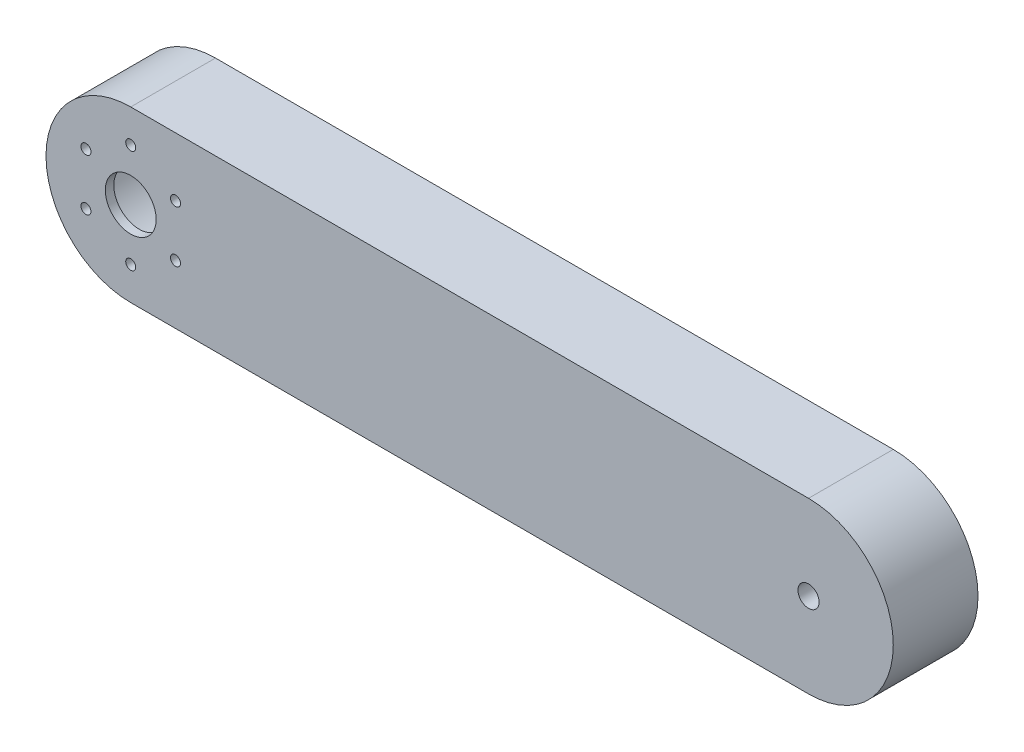
ISO-10303-21;
HEADER;
FILE_DESCRIPTION(('STEP AP214'),'2;1');
FILE_NAME('part.step','',(''),(''),'','','');
FILE_SCHEMA(('AUTOMOTIVE_DESIGN { 1 0 10303 214 1 1 1 1 }'));
ENDSEC;
DATA;
#1=APPLICATION_CONTEXT('core data for automotive mechanical design processes');
#2=APPLICATION_PROTOCOL_DEFINITION('international standard','automotive_design',2000,#1);
#3=PRODUCT_CONTEXT('',#1,'mechanical');
#4=PRODUCT('Part','Part','',(#3));
#5=PRODUCT_RELATED_PRODUCT_CATEGORY('part','',(#4));
#6=PRODUCT_DEFINITION_FORMATION('','',#4);
#7=PRODUCT_DEFINITION_CONTEXT('part definition',#1,'design');
#8=PRODUCT_DEFINITION('design','',#6,#7);
#9=PRODUCT_DEFINITION_SHAPE('','',#8);
#10=(LENGTH_UNIT() NAMED_UNIT(*) SI_UNIT(.MILLI.,.METRE.));
#11=(NAMED_UNIT(*) PLANE_ANGLE_UNIT() SI_UNIT($,.RADIAN.));
#12=(NAMED_UNIT(*) SI_UNIT($,.STERADIAN.) SOLID_ANGLE_UNIT());
#13=UNCERTAINTY_MEASURE_WITH_UNIT(LENGTH_MEASURE(1.E-05),#10,'distance_accuracy_value','');
#14=(GEOMETRIC_REPRESENTATION_CONTEXT(3) GLOBAL_UNCERTAINTY_ASSIGNED_CONTEXT((#13)) GLOBAL_UNIT_ASSIGNED_CONTEXT((#10,
#11,#12)) REPRESENTATION_CONTEXT('',''));
#15=CARTESIAN_POINT('',(0.,0.,0.));
#16=DIRECTION('',(0.,0.,1.));
#17=DIRECTION('',(1.,0.,0.));
#18=AXIS2_PLACEMENT_3D('',#15,#16,#17);
#19=CARTESIAN_POINT('',(-101.6,0.,22.86));
#20=DIRECTION('',(0.,0.,1.));
#21=DIRECTION('',(1.,0.,0.));
#22=AXIS2_PLACEMENT_3D('',#19,#20,#21);
#23=PLANE('',#22);
#24=CARTESIAN_POINT('',(-88.1766062517335,7.74999999399999,22.86));
#25=DIRECTION('',(0.,0.,-1.));
#26=DIRECTION('',(-1.,0.,0.));
#27=AXIS2_PLACEMENT_3D('',#24,#25,#26);
#28=CIRCLE('',#27,1.50000004800001);
#29=CARTESIAN_POINT('',(-89.6766062997335,7.74999999399999,22.86));
#30=VERTEX_POINT('',#29);
#31=EDGE_CURVE('E166',#30,#30,#28,.T.);
#32=ORIENTED_EDGE('',*,*,#31,.F.);
#33=EDGE_LOOP('',(#32));
#34=FACE_BOUND('',#33,.T.);
#35=CARTESIAN_POINT('',(-88.1766062517335,-7.74999999400002,22.86));
#36=DIRECTION('',(0.,0.,-1.));
#37=DIRECTION('',(-1.,0.,0.));
#38=AXIS2_PLACEMENT_3D('',#35,#36,#37);
#39=CIRCLE('',#38,1.50000004800001);
#40=CARTESIAN_POINT('',(-89.6766062997335,-7.74999999400002,22.86));
#41=VERTEX_POINT('',#40);
#42=EDGE_CURVE('E173',#41,#41,#39,.T.);
#43=ORIENTED_EDGE('',*,*,#42,.F.);
#44=EDGE_LOOP('',(#43));
#45=FACE_BOUND('',#44,.T.);
#46=CARTESIAN_POINT('',(-101.6,-15.499999988,22.86));
#47=DIRECTION('',(0.,0.,-1.));
#48=DIRECTION('',(-1.,0.,0.));
#49=AXIS2_PLACEMENT_3D('',#46,#47,#48);
#50=CIRCLE('',#49,1.500000048);
#51=CARTESIAN_POINT('',(-103.100000048,-15.499999988,22.86));
#52=VERTEX_POINT('',#51);
#53=EDGE_CURVE('E179',#52,#52,#50,.T.);
#54=ORIENTED_EDGE('',*,*,#53,.F.);
#55=EDGE_LOOP('',(#54));
#56=FACE_BOUND('',#55,.T.);
#57=CARTESIAN_POINT('',(-115.023393748266,-7.74999999400001,22.86));
#58=DIRECTION('',(0.,0.,-1.));
#59=DIRECTION('',(-1.,0.,0.));
#60=AXIS2_PLACEMENT_3D('',#57,#58,#59);
#61=CIRCLE('',#60,1.50000004800001);
#62=CARTESIAN_POINT('',(-116.523393796267,-7.74999999400001,22.86));
#63=VERTEX_POINT('',#62);
#64=EDGE_CURVE('E185',#63,#63,#61,.T.);
#65=ORIENTED_EDGE('',*,*,#64,.F.);
#66=EDGE_LOOP('',(#65));
#67=FACE_BOUND('',#66,.T.);
#68=CARTESIAN_POINT('',(-115.023393748266,7.74999999399999,22.86));
#69=DIRECTION('',(0.,0.,-1.));
#70=DIRECTION('',(-1.,0.,0.));
#71=AXIS2_PLACEMENT_3D('',#68,#69,#70);
#72=CIRCLE('',#71,1.500000048);
#73=CARTESIAN_POINT('',(-116.523393796267,7.74999999399999,22.86));
#74=VERTEX_POINT('',#73);
#75=EDGE_CURVE('E191',#74,#74,#72,.T.);
#76=ORIENTED_EDGE('',*,*,#75,.F.);
#77=EDGE_LOOP('',(#76));
#78=FACE_BOUND('',#77,.T.);
#79=CARTESIAN_POINT('',(-101.6,15.499999988,22.86));
#80=DIRECTION('',(0.,0.,-1.));
#81=DIRECTION('',(-1.,0.,0.));
#82=AXIS2_PLACEMENT_3D('',#79,#80,#81);
#83=CIRCLE('',#82,1.500000048);
#84=CARTESIAN_POINT('',(-103.100000048,15.499999988,22.86));
#85=VERTEX_POINT('',#84);
#86=EDGE_CURVE('E160',#85,#85,#83,.T.);
#87=ORIENTED_EDGE('',*,*,#86,.F.);
#88=EDGE_LOOP('',(#87));
#89=FACE_BOUND('',#88,.T.);
#90=CARTESIAN_POINT('',(-101.6,0.,22.86));
#91=DIRECTION('',(0.,0.,1.));
#92=DIRECTION('',(1.,0.,0.));
#93=AXIS2_PLACEMENT_3D('',#90,#91,#92);
#94=CIRCLE('',#93,19.05);
#95=CARTESIAN_POINT('',(-120.65,0.,22.86));
#96=VERTEX_POINT('',#95);
#97=EDGE_CURVE('E130',#96,#96,#94,.T.);
#98=ORIENTED_EDGE('',*,*,#97,.F.);
#99=EDGE_LOOP('',(#98));
#100=FACE_BOUND('',#99,.T.);
#101=CARTESIAN_POINT('',(-101.6,0.,22.86));
#102=DIRECTION('',(0.,0.,-1.));
#103=DIRECTION('',(-1.,0.,0.));
#104=AXIS2_PLACEMENT_3D('',#101,#102,#103);
#105=CIRCLE('',#104,7.62);
#106=CARTESIAN_POINT('',(-109.22,0.,22.86));
#107=VERTEX_POINT('',#106);
#108=EDGE_CURVE('E157',#107,#107,#105,.T.);
#109=ORIENTED_EDGE('',*,*,#108,.F.);
#110=EDGE_LOOP('',(#109));
#111=FACE_BOUND('',#110,.T.);
#112=ADVANCED_FACE('F73',(#34,#45,#56,#67,#78,#89,#100,#111),#23,.F.);
#113=CARTESIAN_POINT('',(-101.6,0.,0.));
#114=DIRECTION('',(0.,0.,1.));
#115=DIRECTION('',(1.,0.,0.));
#116=AXIS2_PLACEMENT_3D('',#113,#114,#115);
#117=PLANE('',#116);
#118=CARTESIAN_POINT('',(101.6,0.,0.));
#119=DIRECTION('',(0.,0.,1.));
#120=DIRECTION('',(1.,0.,0.));
#121=AXIS2_PLACEMENT_3D('',#118,#119,#120);
#122=CIRCLE('',#121,3.175);
#123=CARTESIAN_POINT('',(104.775,0.,0.));
#124=VERTEX_POINT('',#123);
#125=EDGE_CURVE('E167',#124,#124,#122,.T.);
#126=ORIENTED_EDGE('',*,*,#125,.T.);
#127=EDGE_LOOP('',(#126));
#128=FACE_BOUND('',#127,.T.);
#129=CARTESIAN_POINT('',(-101.6,0.,0.));
#130=DIRECTION('',(0.,0.,1.));
#131=DIRECTION('',(1.,0.,0.));
#132=AXIS2_PLACEMENT_3D('',#129,#130,#131);
#133=CIRCLE('',#132,19.05);
#134=CARTESIAN_POINT('',(-120.65,0.,0.));
#135=VERTEX_POINT('',#134);
#136=EDGE_CURVE('E153',#135,#135,#133,.T.);
#137=ORIENTED_EDGE('',*,*,#136,.T.);
#138=EDGE_LOOP('',(#137));
#139=FACE_BOUND('',#138,.T.);
#140=CARTESIAN_POINT('',(-101.6,0.,0.));
#141=DIRECTION('',(0.,0.,1.));
#142=DIRECTION('',(1.,0.,0.));
#143=AXIS2_PLACEMENT_3D('',#140,#141,#142);
#144=CIRCLE('',#143,25.4);
#145=CARTESIAN_POINT('',(-101.6,25.4,0.));
#146=VERTEX_POINT('',#145);
#147=CARTESIAN_POINT('',(-101.6,-25.4,0.));
#148=VERTEX_POINT('',#147);
#149=EDGE_CURVE('E122',#146,#148,#144,.T.);
#150=ORIENTED_EDGE('',*,*,#149,.F.);
#151=DIRECTION('',(1.,0.,0.));
#152=VECTOR('',#151,1.);
#153=CARTESIAN_POINT('',(-101.6,25.4,0.));
#154=LINE('',#153,#152);
#155=CARTESIAN_POINT('',(101.6,25.4,0.));
#156=VERTEX_POINT('',#155);
#157=EDGE_CURVE('E129',#146,#156,#154,.T.);
#158=ORIENTED_EDGE('',*,*,#157,.T.);
#159=CARTESIAN_POINT('',(101.6,0.,0.));
#160=DIRECTION('',(0.,0.,1.));
#161=DIRECTION('',(1.,0.,0.));
#162=AXIS2_PLACEMENT_3D('',#159,#160,#161);
#163=CIRCLE('',#162,25.4);
#164=CARTESIAN_POINT('',(101.6,-25.4,0.));
#165=VERTEX_POINT('',#164);
#166=EDGE_CURVE('E77',#165,#156,#163,.T.);
#167=ORIENTED_EDGE('',*,*,#166,.F.);
#168=DIRECTION('',(1.,0.,0.));
#169=VECTOR('',#168,1.);
#170=CARTESIAN_POINT('',(-101.6,-25.4000000000001,0.));
#171=LINE('',#170,#169);
#172=EDGE_CURVE('E128',#148,#165,#171,.T.);
#173=ORIENTED_EDGE('',*,*,#172,.F.);
#174=EDGE_LOOP('',(#150,#158,#167,#173));
#175=FACE_BOUND('',#174,.T.);
#176=ADVANCED_FACE('F127',(#128,#139,#175),#117,.F.);
#177=CARTESIAN_POINT('',(-101.6,0.,25.4));
#178=DIRECTION('',(0.,0.,1.));
#179=DIRECTION('',(1.,0.,0.));
#180=AXIS2_PLACEMENT_3D('',#177,#178,#179);
#181=PLANE('',#180);
#182=CARTESIAN_POINT('',(101.6,0.,25.4));
#183=DIRECTION('',(0.,0.,1.));
#184=DIRECTION('',(1.,0.,0.));
#185=AXIS2_PLACEMENT_3D('',#182,#183,#184);
#186=CIRCLE('',#185,3.175);
#187=CARTESIAN_POINT('',(104.775,0.,25.4));
#188=VERTEX_POINT('',#187);
#189=EDGE_CURVE('E199',#188,#188,#186,.T.);
#190=ORIENTED_EDGE('',*,*,#189,.F.);
#191=EDGE_LOOP('',(#190));
#192=FACE_BOUND('',#191,.T.);
#193=CARTESIAN_POINT('',(-88.1766062517335,7.74999999399999,25.4));
#194=DIRECTION('',(0.,0.,-1.));
#195=DIRECTION('',(-1.,0.,0.));
#196=AXIS2_PLACEMENT_3D('',#193,#194,#195);
#197=CIRCLE('',#196,1.50000004800001);
#198=CARTESIAN_POINT('',(-89.6766062997335,7.74999999399999,25.4));
#199=VERTEX_POINT('',#198);
#200=EDGE_CURVE('E163',#199,#199,#197,.T.);
#201=ORIENTED_EDGE('',*,*,#200,.T.);
#202=EDGE_LOOP('',(#201));
#203=FACE_BOUND('',#202,.T.);
#204=CARTESIAN_POINT('',(-88.1766062517335,-7.74999999400002,25.4));
#205=DIRECTION('',(0.,0.,-1.));
#206=DIRECTION('',(-1.,0.,0.));
#207=AXIS2_PLACEMENT_3D('',#204,#205,#206);
#208=CIRCLE('',#207,1.50000004800001);
#209=CARTESIAN_POINT('',(-89.6766062997335,-7.74999999400002,25.4));
#210=VERTEX_POINT('',#209);
#211=EDGE_CURVE('E170',#210,#210,#208,.T.);
#212=ORIENTED_EDGE('',*,*,#211,.T.);
#213=EDGE_LOOP('',(#212));
#214=FACE_BOUND('',#213,.T.);
#215=CARTESIAN_POINT('',(-101.6,-15.499999988,25.4));
#216=DIRECTION('',(0.,0.,-1.));
#217=DIRECTION('',(-1.,0.,0.));
#218=AXIS2_PLACEMENT_3D('',#215,#216,#217);
#219=CIRCLE('',#218,1.500000048);
#220=CARTESIAN_POINT('',(-103.100000048,-15.499999988,25.4));
#221=VERTEX_POINT('',#220);
#222=EDGE_CURVE('E176',#221,#221,#219,.T.);
#223=ORIENTED_EDGE('',*,*,#222,.T.);
#224=EDGE_LOOP('',(#223));
#225=FACE_BOUND('',#224,.T.);
#226=CARTESIAN_POINT('',(-115.023393748266,-7.74999999400001,25.4));
#227=DIRECTION('',(0.,0.,-1.));
#228=DIRECTION('',(-1.,0.,0.));
#229=AXIS2_PLACEMENT_3D('',#226,#227,#228);
#230=CIRCLE('',#229,1.50000004800001);
#231=CARTESIAN_POINT('',(-116.523393796267,-7.74999999400001,25.4));
#232=VERTEX_POINT('',#231);
#233=EDGE_CURVE('E182',#232,#232,#230,.T.);
#234=ORIENTED_EDGE('',*,*,#233,.T.);
#235=EDGE_LOOP('',(#234));
#236=FACE_BOUND('',#235,.T.);
#237=CARTESIAN_POINT('',(-115.023393748266,7.74999999399999,25.4));
#238=DIRECTION('',(0.,0.,-1.));
#239=DIRECTION('',(-1.,0.,0.));
#240=AXIS2_PLACEMENT_3D('',#237,#238,#239);
#241=CIRCLE('',#240,1.500000048);
#242=CARTESIAN_POINT('',(-116.523393796267,7.74999999399999,25.4));
#243=VERTEX_POINT('',#242);
#244=EDGE_CURVE('E188',#243,#243,#241,.T.);
#245=ORIENTED_EDGE('',*,*,#244,.T.);
#246=EDGE_LOOP('',(#245));
#247=FACE_BOUND('',#246,.T.);
#248=CARTESIAN_POINT('',(-101.6,15.499999988,25.4));
#249=DIRECTION('',(0.,0.,-1.));
#250=DIRECTION('',(-1.,0.,0.));
#251=AXIS2_PLACEMENT_3D('',#248,#249,#250);
#252=CIRCLE('',#251,1.500000048);
#253=CARTESIAN_POINT('',(-103.100000048,15.499999988,25.4));
#254=VERTEX_POINT('',#253);
#255=EDGE_CURVE('E194',#254,#254,#252,.T.);
#256=ORIENTED_EDGE('',*,*,#255,.T.);
#257=EDGE_LOOP('',(#256));
#258=FACE_BOUND('',#257,.T.);
#259=CARTESIAN_POINT('',(-101.6,0.,25.4));
#260=DIRECTION('',(0.,0.,-1.));
#261=DIRECTION('',(-1.,0.,0.));
#262=AXIS2_PLACEMENT_3D('',#259,#260,#261);
#263=CIRCLE('',#262,7.62);
#264=CARTESIAN_POINT('',(-109.22,0.,25.4));
#265=VERTEX_POINT('',#264);
#266=EDGE_CURVE('E156',#265,#265,#263,.T.);
#267=ORIENTED_EDGE('',*,*,#266,.T.);
#268=EDGE_LOOP('',(#267));
#269=FACE_BOUND('',#268,.T.);
#270=CARTESIAN_POINT('',(-101.6,0.,25.4));
#271=DIRECTION('',(0.,0.,1.));
#272=DIRECTION('',(1.,0.,0.));
#273=AXIS2_PLACEMENT_3D('',#270,#271,#272);
#274=CIRCLE('',#273,25.4);
#275=CARTESIAN_POINT('',(-101.6,25.4,25.4));
#276=VERTEX_POINT('',#275);
#277=CARTESIAN_POINT('',(-101.6,-25.4,25.4));
#278=VERTEX_POINT('',#277);
#279=EDGE_CURVE('E145',#276,#278,#274,.T.);
#280=ORIENTED_EDGE('',*,*,#279,.T.);
#281=DIRECTION('',(1.,0.,0.));
#282=VECTOR('',#281,1.);
#283=CARTESIAN_POINT('',(-101.6,-25.4000000000001,25.4));
#284=LINE('',#283,#282);
#285=CARTESIAN_POINT('',(101.6,-25.4,25.4));
#286=VERTEX_POINT('',#285);
#287=EDGE_CURVE('E134',#278,#286,#284,.T.);
#288=ORIENTED_EDGE('',*,*,#287,.T.);
#289=CARTESIAN_POINT('',(101.6,0.,25.4));
#290=DIRECTION('',(0.,0.,1.));
#291=DIRECTION('',(1.,0.,0.));
#292=AXIS2_PLACEMENT_3D('',#289,#290,#291);
#293=CIRCLE('',#292,25.4);
#294=CARTESIAN_POINT('',(101.6,25.4,25.4));
#295=VERTEX_POINT('',#294);
#296=EDGE_CURVE('E118',#286,#295,#293,.T.);
#297=ORIENTED_EDGE('',*,*,#296,.T.);
#298=DIRECTION('',(1.,0.,0.));
#299=VECTOR('',#298,1.);
#300=CARTESIAN_POINT('',(-101.6,25.4,25.4));
#301=LINE('',#300,#299);
#302=EDGE_CURVE('E132',#276,#295,#301,.T.);
#303=ORIENTED_EDGE('',*,*,#302,.F.);
#304=EDGE_LOOP('',(#280,#288,#297,#303));
#305=FACE_BOUND('',#304,.T.);
#306=ADVANCED_FACE('F142',(#192,#203,#214,#225,#236,#247,#258,#269,#305),#181,.T.);
#307=CARTESIAN_POINT('',(-101.6,0.,25.4));
#308=DIRECTION('',(0.,0.,-1.));
#309=DIRECTION('',(-1.,0.,0.));
#310=AXIS2_PLACEMENT_3D('',#307,#308,#309);
#311=CYLINDRICAL_SURFACE('',#310,25.4);
#312=ORIENTED_EDGE('',*,*,#279,.F.);
#313=DIRECTION('',(0.,0.,-1.));
#314=VECTOR('',#313,1.);
#315=CARTESIAN_POINT('',(-101.6,25.4,25.4));
#316=LINE('',#315,#314);
#317=EDGE_CURVE('E13',#276,#146,#316,.T.);
#318=ORIENTED_EDGE('',*,*,#317,.T.);
#319=ORIENTED_EDGE('',*,*,#149,.T.);
#320=DIRECTION('',(0.,0.,-1.));
#321=VECTOR('',#320,1.);
#322=CARTESIAN_POINT('',(-101.6,-25.4,25.4));
#323=LINE('',#322,#321);
#324=EDGE_CURVE('E83',#278,#148,#323,.T.);
#325=ORIENTED_EDGE('',*,*,#324,.F.);
#326=EDGE_LOOP('',(#312,#318,#319,#325));
#327=FACE_BOUND('',#326,.T.);
#328=ADVANCED_FACE('F144',(#327),#311,.T.);
#329=CARTESIAN_POINT('',(101.6,0.,25.4));
#330=DIRECTION('',(0.,0.,-1.));
#331=DIRECTION('',(-1.,0.,0.));
#332=AXIS2_PLACEMENT_3D('',#329,#330,#331);
#333=CYLINDRICAL_SURFACE('',#332,25.4);
#334=ORIENTED_EDGE('',*,*,#166,.T.);
#335=DIRECTION('',(0.,0.,-1.));
#336=VECTOR('',#335,1.);
#337=CARTESIAN_POINT('',(101.6,25.4,25.4));
#338=LINE('',#337,#336);
#339=EDGE_CURVE('E109',#295,#156,#338,.T.);
#340=ORIENTED_EDGE('',*,*,#339,.F.);
#341=ORIENTED_EDGE('',*,*,#296,.F.);
#342=DIRECTION('',(0.,0.,-1.));
#343=VECTOR('',#342,1.);
#344=CARTESIAN_POINT('',(101.6,-25.4,25.4));
#345=LINE('',#344,#343);
#346=EDGE_CURVE('E114',#286,#165,#345,.T.);
#347=ORIENTED_EDGE('',*,*,#346,.T.);
#348=EDGE_LOOP('',(#334,#340,#341,#347));
#349=FACE_BOUND('',#348,.T.);
#350=ADVANCED_FACE('F75',(#349),#333,.T.);
#351=CARTESIAN_POINT('',(-101.6,25.4,25.4));
#352=DIRECTION('',(0.,1.,0.));
#353=DIRECTION('',(-1.,0.,0.));
#354=AXIS2_PLACEMENT_3D('',#351,#352,#353);
#355=PLANE('',#354);
#356=ORIENTED_EDGE('',*,*,#157,.F.);
#357=ORIENTED_EDGE('',*,*,#317,.F.);
#358=ORIENTED_EDGE('',*,*,#302,.T.);
#359=ORIENTED_EDGE('',*,*,#339,.T.);
#360=EDGE_LOOP('',(#356,#357,#358,#359));
#361=FACE_BOUND('',#360,.T.);
#362=ADVANCED_FACE('F143',(#361),#355,.T.);
#363=CARTESIAN_POINT('',(-101.6,-25.4000000000001,25.4));
#364=DIRECTION('',(0.,1.,0.));
#365=DIRECTION('',(-1.,0.,0.));
#366=AXIS2_PLACEMENT_3D('',#363,#364,#365);
#367=PLANE('',#366);
#368=ORIENTED_EDGE('',*,*,#172,.T.);
#369=ORIENTED_EDGE('',*,*,#346,.F.);
#370=ORIENTED_EDGE('',*,*,#287,.F.);
#371=ORIENTED_EDGE('',*,*,#324,.T.);
#372=EDGE_LOOP('',(#368,#369,#370,#371));
#373=FACE_BOUND('',#372,.T.);
#374=ADVANCED_FACE('F131',(#373),#367,.F.);
#375=CARTESIAN_POINT('',(-101.6,0.,79.2815367264149));
#376=DIRECTION('',(0.,0.,-1.));
#377=DIRECTION('',(-1.,0.,0.));
#378=AXIS2_PLACEMENT_3D('',#375,#376,#377);
#379=CYLINDRICAL_SURFACE('',#378,19.05);
#380=CARTESIAN_POINT('',(-120.65,0.,0.));
#381=CARTESIAN_POINT('',(-120.65,0.,0.238125000000001));
#382=CARTESIAN_POINT('',(-120.65,0.,0.476250000000002));
#383=CARTESIAN_POINT('',(-120.65,0.,0.952500000000004));
#384=CARTESIAN_POINT('',(-120.65,0.,1.19062500000001));
#385=CARTESIAN_POINT('',(-120.65,0.,1.666875));
#386=CARTESIAN_POINT('',(-120.65,0.,1.905));
#387=CARTESIAN_POINT('',(-120.65,0.,2.38125));
#388=CARTESIAN_POINT('',(-120.65,0.,2.619375));
#389=CARTESIAN_POINT('',(-120.65,0.,3.095625));
#390=CARTESIAN_POINT('',(-120.65,0.,3.33375));
#391=CARTESIAN_POINT('',(-120.65,0.,3.81));
#392=CARTESIAN_POINT('',(-120.65,0.,4.048125));
#393=CARTESIAN_POINT('',(-120.65,0.,4.52437500000001));
#394=CARTESIAN_POINT('',(-120.65,0.,4.76250000000001));
#395=CARTESIAN_POINT('',(-120.65,0.,5.23875));
#396=CARTESIAN_POINT('',(-120.65,0.,5.476875));
#397=CARTESIAN_POINT('',(-120.65,0.,5.953125));
#398=CARTESIAN_POINT('',(-120.65,0.,6.19125));
#399=CARTESIAN_POINT('',(-120.65,0.,6.6675));
#400=CARTESIAN_POINT('',(-120.65,0.,6.905625));
#401=CARTESIAN_POINT('',(-120.65,0.,7.38187500000001));
#402=CARTESIAN_POINT('',(-120.65,0.,7.62000000000001));
#403=CARTESIAN_POINT('',(-120.65,0.,8.09625));
#404=CARTESIAN_POINT('',(-120.65,0.,8.334375));
#405=CARTESIAN_POINT('',(-120.65,0.,8.810625));
#406=CARTESIAN_POINT('',(-120.65,0.,9.04875));
#407=CARTESIAN_POINT('',(-120.65,0.,9.525));
#408=CARTESIAN_POINT('',(-120.65,0.,9.763125));
#409=CARTESIAN_POINT('',(-120.65,0.,10.239375));
#410=CARTESIAN_POINT('',(-120.65,0.,10.4775));
#411=CARTESIAN_POINT('',(-120.65,0.,10.95375));
#412=CARTESIAN_POINT('',(-120.65,0.,11.191875));
#413=CARTESIAN_POINT('',(-120.65,0.,11.668125));
#414=CARTESIAN_POINT('',(-120.65,0.,11.90625));
#415=CARTESIAN_POINT('',(-120.65,0.,12.3825));
#416=CARTESIAN_POINT('',(-120.65,0.,12.620625));
#417=CARTESIAN_POINT('',(-120.65,0.,13.096875));
#418=CARTESIAN_POINT('',(-120.65,0.,13.335));
#419=CARTESIAN_POINT('',(-120.65,0.,13.81125));
#420=CARTESIAN_POINT('',(-120.65,0.,14.049375));
#421=CARTESIAN_POINT('',(-120.65,0.,14.525625));
#422=CARTESIAN_POINT('',(-120.65,0.,14.76375));
#423=CARTESIAN_POINT('',(-120.65,0.,15.24));
#424=CARTESIAN_POINT('',(-120.65,0.,15.478125));
#425=CARTESIAN_POINT('',(-120.65,0.,15.954375));
#426=CARTESIAN_POINT('',(-120.65,0.,16.1925));
#427=CARTESIAN_POINT('',(-120.65,0.,16.66875));
#428=CARTESIAN_POINT('',(-120.65,0.,16.906875));
#429=CARTESIAN_POINT('',(-120.65,0.,17.383125));
#430=CARTESIAN_POINT('',(-120.65,0.,17.62125));
#431=CARTESIAN_POINT('',(-120.65,0.,18.0975));
#432=CARTESIAN_POINT('',(-120.65,0.,18.335625));
#433=CARTESIAN_POINT('',(-120.65,0.,18.811875));
#434=CARTESIAN_POINT('',(-120.65,0.,19.05));
#435=CARTESIAN_POINT('',(-120.65,0.,19.52625));
#436=CARTESIAN_POINT('',(-120.65,0.,19.764375));
#437=CARTESIAN_POINT('',(-120.65,0.,20.240625));
#438=CARTESIAN_POINT('',(-120.65,0.,20.47875));
#439=CARTESIAN_POINT('',(-120.65,0.,20.955));
#440=CARTESIAN_POINT('',(-120.65,0.,21.193125));
#441=CARTESIAN_POINT('',(-120.65,0.,21.669375));
#442=CARTESIAN_POINT('',(-120.65,0.,21.9075));
#443=CARTESIAN_POINT('',(-120.65,0.,22.38375));
#444=CARTESIAN_POINT('',(-120.65,0.,22.621875));
#445=CARTESIAN_POINT('',(-120.65,0.,22.86));
#446=B_SPLINE_CURVE_WITH_KNOTS('',3,(#380,#381,#382,#383,#384,#385,#386,#387,#388,#389,#390,
#391,#392,#393,#394,#395,#396,#397,#398,#399,#400,#401,#402,#403,#404,#405,#406,#407,#408,#409,
#410,#411,#412,#413,#414,#415,#416,#417,#418,#419,#420,#421,#422,#423,#424,#425,#426,#427,#428,
#429,#430,#431,#432,#433,#434,#435,#436,#437,#438,#439,#440,#441,#442,#443,#444,#445),
.UNSPECIFIED.,.F.,.F.,(4,2,2,2,2,2,2,2,2,2,2,2,2,2,2,2,2,2,2,2,2,2,2,2,2,2,2,2,2,2,2,2,4),(0.,
0.714375000000003,1.42875000000001,2.143125,2.8575,3.571875,4.28625000000001,5.00062500000001,
5.715,6.429375,7.14375,7.85812500000001,8.5725,9.286875,10.00125,10.715625,11.43,12.144375,
12.85875,13.573125,14.2875,15.001875,15.71625,16.430625,17.145,17.859375,18.57375,19.288125,
20.0025,20.716875,21.43125,22.145625,22.86),.UNSPECIFIED.);
#447=EDGE_CURVE('BSEAM217',#135,#96,#446,.T.);
#448=ORIENTED_EDGE('',*,*,#136,.F.);
#449=ORIENTED_EDGE('',*,*,#97,.T.);
#450=ORIENTED_EDGE('',*,*,#447,.T.);
#451=ORIENTED_EDGE('',*,*,#447,.F.);
#452=EDGE_LOOP('',(#448,#450,#449,#451));
#453=FACE_BOUND('',#452,.T.);
#454=ADVANCED_FACE('F217',(#453),#379,.F.);
#455=CARTESIAN_POINT('',(-101.6,15.499999988,25.4));
#456=DIRECTION('',(0.,0.,-1.));
#457=DIRECTION('',(-1.,0.,0.));
#458=AXIS2_PLACEMENT_3D('',#455,#456,#457);
#459=CYLINDRICAL_SURFACE('',#458,1.500000048);
#460=ORIENTED_EDGE('',*,*,#255,.F.);
#461=EDGE_LOOP('',(#460));
#462=FACE_BOUND('',#461,.T.);
#463=ORIENTED_EDGE('',*,*,#86,.T.);
#464=EDGE_LOOP('',(#463));
#465=FACE_BOUND('',#464,.T.);
#466=ADVANCED_FACE('F326',(#462,#465),#459,.F.);
#467=CARTESIAN_POINT('',(-115.023393748266,7.74999999399999,25.4));
#468=DIRECTION('',(0.,0.,-1.));
#469=DIRECTION('',(-1.,0.,0.));
#470=AXIS2_PLACEMENT_3D('',#467,#468,#469);
#471=CYLINDRICAL_SURFACE('',#470,1.500000048);
#472=ORIENTED_EDGE('',*,*,#244,.F.);
#473=EDGE_LOOP('',(#472));
#474=FACE_BOUND('',#473,.T.);
#475=ORIENTED_EDGE('',*,*,#75,.T.);
#476=EDGE_LOOP('',(#475));
#477=FACE_BOUND('',#476,.T.);
#478=ADVANCED_FACE('F318',(#474,#477),#471,.F.);
#479=CARTESIAN_POINT('',(-115.023393748266,-7.74999999400001,25.4));
#480=DIRECTION('',(0.,0.,-1.));
#481=DIRECTION('',(-1.,0.,0.));
#482=AXIS2_PLACEMENT_3D('',#479,#480,#481);
#483=CYLINDRICAL_SURFACE('',#482,1.50000004800001);
#484=ORIENTED_EDGE('',*,*,#233,.F.);
#485=EDGE_LOOP('',(#484));
#486=FACE_BOUND('',#485,.T.);
#487=ORIENTED_EDGE('',*,*,#64,.T.);
#488=EDGE_LOOP('',(#487));
#489=FACE_BOUND('',#488,.T.);
#490=ADVANCED_FACE('F309',(#486,#489),#483,.F.);
#491=CARTESIAN_POINT('',(-101.6,-15.499999988,25.4));
#492=DIRECTION('',(0.,0.,-1.));
#493=DIRECTION('',(-1.,0.,0.));
#494=AXIS2_PLACEMENT_3D('',#491,#492,#493);
#495=CYLINDRICAL_SURFACE('',#494,1.500000048);
#496=ORIENTED_EDGE('',*,*,#222,.F.);
#497=EDGE_LOOP('',(#496));
#498=FACE_BOUND('',#497,.T.);
#499=ORIENTED_EDGE('',*,*,#53,.T.);
#500=EDGE_LOOP('',(#499));
#501=FACE_BOUND('',#500,.T.);
#502=ADVANCED_FACE('F300',(#498,#501),#495,.F.);
#503=CARTESIAN_POINT('',(-88.1766062517335,-7.74999999400002,25.4));
#504=DIRECTION('',(0.,0.,-1.));
#505=DIRECTION('',(-1.,0.,0.));
#506=AXIS2_PLACEMENT_3D('',#503,#504,#505);
#507=CYLINDRICAL_SURFACE('',#506,1.50000004800001);
#508=ORIENTED_EDGE('',*,*,#211,.F.);
#509=EDGE_LOOP('',(#508));
#510=FACE_BOUND('',#509,.T.);
#511=ORIENTED_EDGE('',*,*,#42,.T.);
#512=EDGE_LOOP('',(#511));
#513=FACE_BOUND('',#512,.T.);
#514=ADVANCED_FACE('F291',(#510,#513),#507,.F.);
#515=CARTESIAN_POINT('',(-88.1766062517335,7.74999999399999,25.4));
#516=DIRECTION('',(0.,0.,-1.));
#517=DIRECTION('',(-1.,0.,0.));
#518=AXIS2_PLACEMENT_3D('',#515,#516,#517);
#519=CYLINDRICAL_SURFACE('',#518,1.50000004800001);
#520=ORIENTED_EDGE('',*,*,#200,.F.);
#521=EDGE_LOOP('',(#520));
#522=FACE_BOUND('',#521,.T.);
#523=ORIENTED_EDGE('',*,*,#31,.T.);
#524=EDGE_LOOP('',(#523));
#525=FACE_BOUND('',#524,.T.);
#526=ADVANCED_FACE('F234',(#522,#525),#519,.F.);
#527=CARTESIAN_POINT('',(-101.6,0.,25.4));
#528=DIRECTION('',(0.,0.,-1.));
#529=DIRECTION('',(-1.,0.,0.));
#530=AXIS2_PLACEMENT_3D('',#527,#528,#529);
#531=CYLINDRICAL_SURFACE('',#530,7.62);
#532=ORIENTED_EDGE('',*,*,#266,.F.);
#533=EDGE_LOOP('',(#532));
#534=FACE_BOUND('',#533,.T.);
#535=ORIENTED_EDGE('',*,*,#108,.T.);
#536=EDGE_LOOP('',(#535));
#537=FACE_BOUND('',#536,.T.);
#538=ADVANCED_FACE('F210',(#534,#537),#531,.F.);
#539=CARTESIAN_POINT('',(101.6,0.,0.));
#540=DIRECTION('',(0.,0.,1.));
#541=DIRECTION('',(1.,0.,0.));
#542=AXIS2_PLACEMENT_3D('',#539,#540,#541);
#543=CYLINDRICAL_SURFACE('',#542,3.175);
#544=ORIENTED_EDGE('',*,*,#125,.F.);
#545=EDGE_LOOP('',(#544));
#546=FACE_BOUND('',#545,.T.);
#547=ORIENTED_EDGE('',*,*,#189,.T.);
#548=EDGE_LOOP('',(#547));
#549=FACE_BOUND('',#548,.T.);
#550=ADVANCED_FACE('F207',(#546,#549),#543,.F.);
#551=CLOSED_SHELL('',(#112,#176,#306,#328,#350,#362,#374,#454,#466,#478,#490,#502,#514,#526,
#538,#550));
#552=MANIFOLD_SOLID_BREP('B2',#551);
#553=ADVANCED_BREP_SHAPE_REPRESENTATION('',(#18,#552),#14);
#554=SHAPE_DEFINITION_REPRESENTATION(#9,#553);
ENDSEC;
END-ISO-10303-21;
